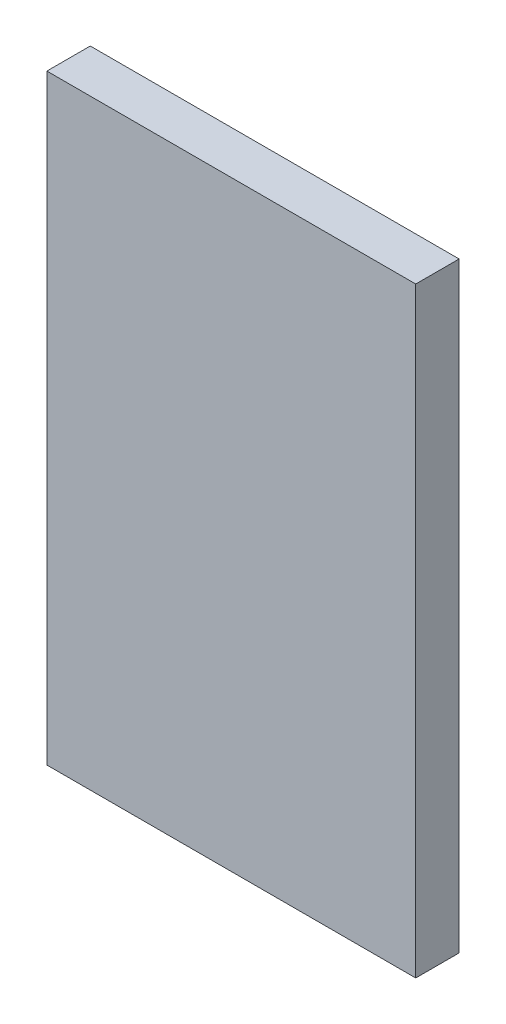
ISO-10303-21;
HEADER;
FILE_DESCRIPTION(('STEP AP214'),'2;1');
FILE_NAME('part.step','',(''),(''),'','','');
FILE_SCHEMA(('AUTOMOTIVE_DESIGN { 1 0 10303 214 1 1 1 1 }'));
ENDSEC;
DATA;
#1=APPLICATION_CONTEXT('core data for automotive mechanical design processes');
#2=APPLICATION_PROTOCOL_DEFINITION('international standard','automotive_design',2000,#1);
#3=PRODUCT_CONTEXT('',#1,'mechanical');
#4=PRODUCT('Part','Part','',(#3));
#5=PRODUCT_RELATED_PRODUCT_CATEGORY('part','',(#4));
#6=PRODUCT_DEFINITION_FORMATION('','',#4);
#7=PRODUCT_DEFINITION_CONTEXT('part definition',#1,'design');
#8=PRODUCT_DEFINITION('design','',#6,#7);
#9=PRODUCT_DEFINITION_SHAPE('','',#8);
#10=(LENGTH_UNIT() NAMED_UNIT(*) SI_UNIT(.MILLI.,.METRE.));
#11=(NAMED_UNIT(*) PLANE_ANGLE_UNIT() SI_UNIT($,.RADIAN.));
#12=(NAMED_UNIT(*) SI_UNIT($,.STERADIAN.) SOLID_ANGLE_UNIT());
#13=UNCERTAINTY_MEASURE_WITH_UNIT(LENGTH_MEASURE(1.E-05),#10,'distance_accuracy_value','');
#14=(GEOMETRIC_REPRESENTATION_CONTEXT(3) GLOBAL_UNCERTAINTY_ASSIGNED_CONTEXT((#13)) GLOBAL_UNIT_ASSIGNED_CONTEXT((#10,
#11,#12)) REPRESENTATION_CONTEXT('',''));
#15=CARTESIAN_POINT('',(0.,0.,0.));
#16=DIRECTION('',(0.,0.,1.));
#17=DIRECTION('',(1.,0.,0.));
#18=AXIS2_PLACEMENT_3D('',#15,#16,#17);
#19=CARTESIAN_POINT('',(-8.50000000000001,-13.85,2.));
#20=DIRECTION('',(1.,0.,0.));
#21=DIRECTION('',(0.,0.,-1.));
#22=AXIS2_PLACEMENT_3D('',#19,#20,#21);
#23=PLANE('',#22);
#24=DIRECTION('',(0.,-1.,0.));
#25=VECTOR('',#24,1.);
#26=CARTESIAN_POINT('',(-8.50000000000001,-13.85,0.));
#27=LINE('',#26,#25);
#28=CARTESIAN_POINT('',(-8.50000000000001,13.85,0.));
#29=VERTEX_POINT('',#28);
#30=CARTESIAN_POINT('',(-8.50000000000001,-13.85,0.));
#31=VERTEX_POINT('',#30);
#32=EDGE_CURVE('E100',#29,#31,#27,.T.);
#33=ORIENTED_EDGE('',*,*,#32,.T.);
#34=DIRECTION('',(0.,0.,-1.));
#35=VECTOR('',#34,1.);
#36=CARTESIAN_POINT('',(-8.50000000000001,-13.85,2.));
#37=LINE('',#36,#35);
#38=CARTESIAN_POINT('',(-8.50000000000001,-13.85,2.));
#39=VERTEX_POINT('',#38);
#40=EDGE_CURVE('E11',#39,#31,#37,.T.);
#41=ORIENTED_EDGE('',*,*,#40,.F.);
#42=DIRECTION('',(0.,-1.,0.));
#43=VECTOR('',#42,1.);
#44=CARTESIAN_POINT('',(-8.50000000000001,-13.85,2.));
#45=LINE('',#44,#43);
#46=CARTESIAN_POINT('',(-8.50000000000001,13.85,2.));
#47=VERTEX_POINT('',#46);
#48=EDGE_CURVE('E88',#47,#39,#45,.T.);
#49=ORIENTED_EDGE('',*,*,#48,.F.);
#50=DIRECTION('',(0.,0.,-1.));
#51=VECTOR('',#50,1.);
#52=CARTESIAN_POINT('',(-8.50000000000001,13.85,2.));
#53=LINE('',#52,#51);
#54=EDGE_CURVE('E96',#47,#29,#53,.T.);
#55=ORIENTED_EDGE('',*,*,#54,.T.);
#56=EDGE_LOOP('',(#33,#41,#49,#55));
#57=FACE_BOUND('',#56,.T.);
#58=ADVANCED_FACE('F37',(#57),#23,.F.);
#59=CARTESIAN_POINT('',(8.49999999999999,-13.85,2.));
#60=DIRECTION('',(0.,1.,0.));
#61=DIRECTION('',(-1.,0.,0.));
#62=AXIS2_PLACEMENT_3D('',#59,#60,#61);
#63=PLANE('',#62);
#64=DIRECTION('',(1.,0.,0.));
#65=VECTOR('',#64,1.);
#66=CARTESIAN_POINT('',(8.49999999999999,-13.85,0.));
#67=LINE('',#66,#65);
#68=CARTESIAN_POINT('',(8.49999999999999,-13.85,0.));
#69=VERTEX_POINT('',#68);
#70=EDGE_CURVE('E92',#31,#69,#67,.T.);
#71=ORIENTED_EDGE('',*,*,#70,.T.);
#72=DIRECTION('',(0.,0.,-1.));
#73=VECTOR('',#72,1.);
#74=CARTESIAN_POINT('',(8.49999999999999,-13.85,2.));
#75=LINE('',#74,#73);
#76=CARTESIAN_POINT('',(8.49999999999999,-13.85,2.));
#77=VERTEX_POINT('',#76);
#78=EDGE_CURVE('E45',#77,#69,#75,.T.);
#79=ORIENTED_EDGE('',*,*,#78,.F.);
#80=DIRECTION('',(1.,0.,0.));
#81=VECTOR('',#80,1.);
#82=CARTESIAN_POINT('',(8.49999999999999,-13.85,2.));
#83=LINE('',#82,#81);
#84=EDGE_CURVE('E83',#39,#77,#83,.T.);
#85=ORIENTED_EDGE('',*,*,#84,.F.);
#86=ORIENTED_EDGE('',*,*,#40,.T.);
#87=EDGE_LOOP('',(#71,#79,#85,#86));
#88=FACE_BOUND('',#87,.T.);
#89=ADVANCED_FACE('F91',(#88),#63,.F.);
#90=CARTESIAN_POINT('',(8.49999999999999,-13.85,2.));
#91=DIRECTION('',(-1.,0.,0.));
#92=DIRECTION('',(0.,0.,1.));
#93=AXIS2_PLACEMENT_3D('',#90,#91,#92);
#94=PLANE('',#93);
#95=DIRECTION('',(0.,1.,0.));
#96=VECTOR('',#95,1.);
#97=CARTESIAN_POINT('',(8.49999999999999,-13.85,0.));
#98=LINE('',#97,#96);
#99=CARTESIAN_POINT('',(8.49999999999999,13.85,0.));
#100=VERTEX_POINT('',#99);
#101=EDGE_CURVE('E70',#69,#100,#98,.T.);
#102=ORIENTED_EDGE('',*,*,#101,.T.);
#103=DIRECTION('',(0.,0.,-1.));
#104=VECTOR('',#103,1.);
#105=CARTESIAN_POINT('',(8.49999999999999,13.85,2.));
#106=LINE('',#105,#104);
#107=CARTESIAN_POINT('',(8.49999999999999,13.85,2.));
#108=VERTEX_POINT('',#107);
#109=EDGE_CURVE('E93',#108,#100,#106,.T.);
#110=ORIENTED_EDGE('',*,*,#109,.F.);
#111=DIRECTION('',(0.,1.,0.));
#112=VECTOR('',#111,1.);
#113=CARTESIAN_POINT('',(8.49999999999999,-13.85,2.));
#114=LINE('',#113,#112);
#115=EDGE_CURVE('E86',#77,#108,#114,.T.);
#116=ORIENTED_EDGE('',*,*,#115,.F.);
#117=ORIENTED_EDGE('',*,*,#78,.T.);
#118=EDGE_LOOP('',(#102,#110,#116,#117));
#119=FACE_BOUND('',#118,.T.);
#120=ADVANCED_FACE('F94',(#119),#94,.F.);
#121=CARTESIAN_POINT('',(8.49999999999999,13.85,2.));
#122=DIRECTION('',(0.,-1.,0.));
#123=DIRECTION('',(1.,0.,0.));
#124=AXIS2_PLACEMENT_3D('',#121,#122,#123);
#125=PLANE('',#124);
#126=DIRECTION('',(-1.,0.,0.));
#127=VECTOR('',#126,1.);
#128=CARTESIAN_POINT('',(8.49999999999999,13.85,0.));
#129=LINE('',#128,#127);
#130=EDGE_CURVE('E76',#100,#29,#129,.T.);
#131=ORIENTED_EDGE('',*,*,#130,.T.);
#132=ORIENTED_EDGE('',*,*,#54,.F.);
#133=DIRECTION('',(-1.,0.,0.));
#134=VECTOR('',#133,1.);
#135=CARTESIAN_POINT('',(8.49999999999999,13.85,2.));
#136=LINE('',#135,#134);
#137=EDGE_CURVE('E53',#108,#47,#136,.T.);
#138=ORIENTED_EDGE('',*,*,#137,.F.);
#139=ORIENTED_EDGE('',*,*,#109,.T.);
#140=EDGE_LOOP('',(#131,#132,#138,#139));
#141=FACE_BOUND('',#140,.T.);
#142=ADVANCED_FACE('F107',(#141),#125,.F.);
#143=CARTESIAN_POINT('',(0.,0.,2.));
#144=DIRECTION('',(0.,0.,1.));
#145=DIRECTION('',(1.,0.,0.));
#146=AXIS2_PLACEMENT_3D('',#143,#144,#145);
#147=PLANE('',#146);
#148=ORIENTED_EDGE('',*,*,#48,.T.);
#149=ORIENTED_EDGE('',*,*,#84,.T.);
#150=ORIENTED_EDGE('',*,*,#115,.T.);
#151=ORIENTED_EDGE('',*,*,#137,.T.);
#152=EDGE_LOOP('',(#148,#149,#150,#151));
#153=FACE_BOUND('',#152,.T.);
#154=ADVANCED_FACE('F84',(#153),#147,.T.);
#155=CARTESIAN_POINT('',(0.,0.,0.));
#156=DIRECTION('',(0.,0.,1.));
#157=DIRECTION('',(1.,0.,0.));
#158=AXIS2_PLACEMENT_3D('',#155,#156,#157);
#159=PLANE('',#158);
#160=ORIENTED_EDGE('',*,*,#32,.F.);
#161=ORIENTED_EDGE('',*,*,#130,.F.);
#162=ORIENTED_EDGE('',*,*,#101,.F.);
#163=ORIENTED_EDGE('',*,*,#70,.F.);
#164=EDGE_LOOP('',(#160,#161,#162,#163));
#165=FACE_BOUND('',#164,.T.);
#166=ADVANCED_FACE('F110',(#165),#159,.F.);
#167=CLOSED_SHELL('',(#58,#89,#120,#142,#154,#166));
#168=MANIFOLD_SOLID_BREP('B2',#167);
#169=ADVANCED_BREP_SHAPE_REPRESENTATION('',(#18,#168),#14);
#170=SHAPE_DEFINITION_REPRESENTATION(#9,#169);
ENDSEC;
END-ISO-10303-21;
